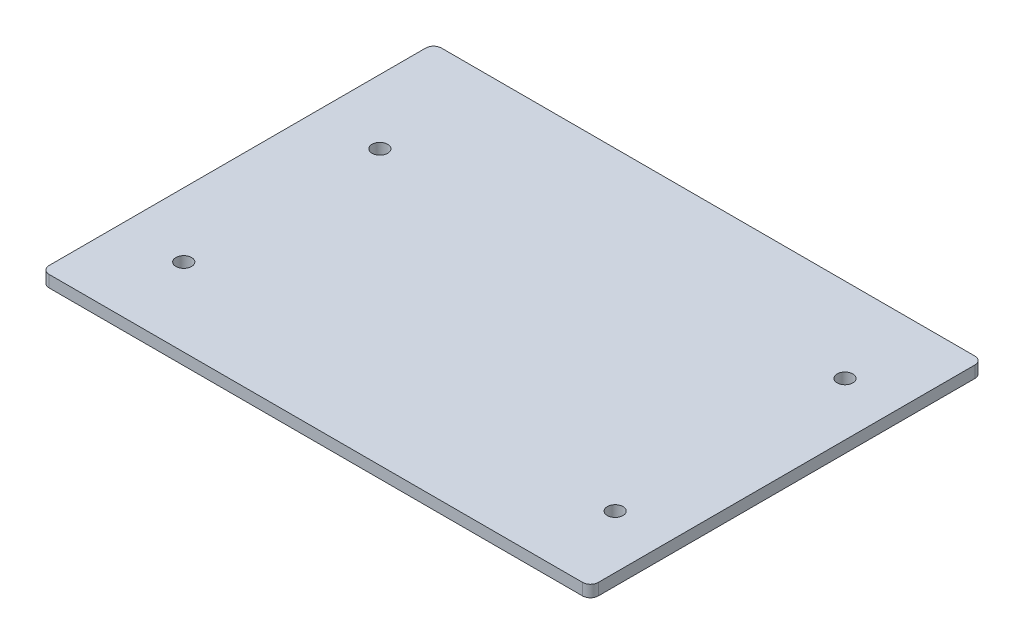
ISO-10303-21;
HEADER;
FILE_DESCRIPTION(('STEP AP214'),'2;1');
FILE_NAME('part.step','',(''),(''),'','','');
FILE_SCHEMA(('AUTOMOTIVE_DESIGN { 1 0 10303 214 1 1 1 1 }'));
ENDSEC;
DATA;
#1=APPLICATION_CONTEXT('core data for automotive mechanical design processes');
#2=APPLICATION_PROTOCOL_DEFINITION('international standard','automotive_design',2000,#1);
#3=PRODUCT_CONTEXT('',#1,'mechanical');
#4=PRODUCT('Part','Part','',(#3));
#5=PRODUCT_RELATED_PRODUCT_CATEGORY('part','',(#4));
#6=PRODUCT_DEFINITION_FORMATION('','',#4);
#7=PRODUCT_DEFINITION_CONTEXT('part definition',#1,'design');
#8=PRODUCT_DEFINITION('design','',#6,#7);
#9=PRODUCT_DEFINITION_SHAPE('','',#8);
#10=(LENGTH_UNIT() NAMED_UNIT(*) SI_UNIT(.MILLI.,.METRE.));
#11=(NAMED_UNIT(*) PLANE_ANGLE_UNIT() SI_UNIT($,.RADIAN.));
#12=(NAMED_UNIT(*) SI_UNIT($,.STERADIAN.) SOLID_ANGLE_UNIT());
#13=UNCERTAINTY_MEASURE_WITH_UNIT(LENGTH_MEASURE(1.E-05),#10,'distance_accuracy_value','');
#14=(GEOMETRIC_REPRESENTATION_CONTEXT(3) GLOBAL_UNCERTAINTY_ASSIGNED_CONTEXT((#13)) GLOBAL_UNIT_ASSIGNED_CONTEXT((#10,
#11,#12)) REPRESENTATION_CONTEXT('',''));
#15=CARTESIAN_POINT('',(0.,0.,0.));
#16=DIRECTION('',(0.,0.,1.));
#17=DIRECTION('',(1.,0.,0.));
#18=AXIS2_PLACEMENT_3D('',#15,#16,#17);
#19=CARTESIAN_POINT('',(0.,3.,50.));
#20=DIRECTION('',(0.,0.,1.));
#21=DIRECTION('',(1.,0.,0.));
#22=AXIS2_PLACEMENT_3D('',#19,#20,#21);
#23=PLANE('',#22);
#24=DIRECTION('',(-1.,0.,0.));
#25=VECTOR('',#24,1.);
#26=CARTESIAN_POINT('',(0.,0.,50.));
#27=LINE('',#26,#25);
#28=CARTESIAN_POINT('',(138.,0.,50.));
#29=VERTEX_POINT('',#28);
#30=CARTESIAN_POINT('',(2.,0.,50.));
#31=VERTEX_POINT('',#30);
#32=EDGE_CURVE('E111',#29,#31,#27,.T.);
#33=ORIENTED_EDGE('',*,*,#32,.F.);
#34=DIRECTION('',(0.,-1.,0.));
#35=VECTOR('',#34,1.);
#36=CARTESIAN_POINT('',(138.,3.,50.));
#37=LINE('',#36,#35);
#38=CARTESIAN_POINT('',(138.,3.,50.));
#39=VERTEX_POINT('',#38);
#40=EDGE_CURVE('E11',#29,#39,#37,.F.);
#41=ORIENTED_EDGE('',*,*,#40,.T.);
#42=DIRECTION('',(-1.,0.,0.));
#43=VECTOR('',#42,1.);
#44=CARTESIAN_POINT('',(0.,3.,50.));
#45=LINE('',#44,#43);
#46=CARTESIAN_POINT('',(2.,3.,50.));
#47=VERTEX_POINT('',#46);
#48=EDGE_CURVE('E163',#39,#47,#45,.T.);
#49=ORIENTED_EDGE('',*,*,#48,.T.);
#50=DIRECTION('',(0.,-1.,0.));
#51=VECTOR('',#50,1.);
#52=CARTESIAN_POINT('',(2.,3.,50.));
#53=LINE('',#52,#51);
#54=EDGE_CURVE('E47',#47,#31,#53,.T.);
#55=ORIENTED_EDGE('',*,*,#54,.T.);
#56=EDGE_LOOP('',(#33,#41,#49,#55));
#57=FACE_BOUND('',#56,.T.);
#58=ADVANCED_FACE('F39',(#57),#23,.T.);
#59=CARTESIAN_POINT('',(140.,3.,0.));
#60=DIRECTION('',(1.,0.,0.));
#61=DIRECTION('',(0.,0.,-1.));
#62=AXIS2_PLACEMENT_3D('',#59,#60,#61);
#63=PLANE('',#62);
#64=DIRECTION('',(0.,0.,1.));
#65=VECTOR('',#64,1.);
#66=CARTESIAN_POINT('',(140.,0.,0.));
#67=LINE('',#66,#65);
#68=CARTESIAN_POINT('',(140.,0.,-48.));
#69=VERTEX_POINT('',#68);
#70=CARTESIAN_POINT('',(140.,0.,48.));
#71=VERTEX_POINT('',#70);
#72=EDGE_CURVE('E185',#69,#71,#67,.T.);
#73=ORIENTED_EDGE('',*,*,#72,.F.);
#74=DIRECTION('',(0.,-1.,0.));
#75=VECTOR('',#74,1.);
#76=CARTESIAN_POINT('',(140.,3.,-48.));
#77=LINE('',#76,#75);
#78=CARTESIAN_POINT('',(140.,3.,-48.));
#79=VERTEX_POINT('',#78);
#80=EDGE_CURVE('E61',#69,#79,#77,.F.);
#81=ORIENTED_EDGE('',*,*,#80,.T.);
#82=DIRECTION('',(0.,0.,1.));
#83=VECTOR('',#82,1.);
#84=CARTESIAN_POINT('',(140.,3.,0.));
#85=LINE('',#84,#83);
#86=CARTESIAN_POINT('',(140.,3.,48.));
#87=VERTEX_POINT('',#86);
#88=EDGE_CURVE('E164',#79,#87,#85,.T.);
#89=ORIENTED_EDGE('',*,*,#88,.T.);
#90=DIRECTION('',(0.,-1.,0.));
#91=VECTOR('',#90,1.);
#92=CARTESIAN_POINT('',(140.,3.,48.));
#93=LINE('',#92,#91);
#94=EDGE_CURVE('E157',#87,#71,#93,.T.);
#95=ORIENTED_EDGE('',*,*,#94,.T.);
#96=EDGE_LOOP('',(#73,#81,#89,#95));
#97=FACE_BOUND('',#96,.T.);
#98=ADVANCED_FACE('F216',(#97),#63,.T.);
#99=CARTESIAN_POINT('',(0.,3.,-50.));
#100=DIRECTION('',(0.,0.,-1.));
#101=DIRECTION('',(-1.,0.,0.));
#102=AXIS2_PLACEMENT_3D('',#99,#100,#101);
#103=PLANE('',#102);
#104=DIRECTION('',(1.,0.,0.));
#105=VECTOR('',#104,1.);
#106=CARTESIAN_POINT('',(0.,0.,-50.));
#107=LINE('',#106,#105);
#108=CARTESIAN_POINT('',(2.,0.,-50.));
#109=VERTEX_POINT('',#108);
#110=CARTESIAN_POINT('',(138.,0.,-50.));
#111=VERTEX_POINT('',#110);
#112=EDGE_CURVE('E127',#109,#111,#107,.T.);
#113=ORIENTED_EDGE('',*,*,#112,.F.);
#114=DIRECTION('',(0.,-1.,0.));
#115=VECTOR('',#114,1.);
#116=CARTESIAN_POINT('',(2.,3.,-50.));
#117=LINE('',#116,#115);
#118=CARTESIAN_POINT('',(2.,3.,-50.));
#119=VERTEX_POINT('',#118);
#120=EDGE_CURVE('E149',#109,#119,#117,.F.);
#121=ORIENTED_EDGE('',*,*,#120,.T.);
#122=DIRECTION('',(1.,0.,0.));
#123=VECTOR('',#122,1.);
#124=CARTESIAN_POINT('',(0.,3.,-50.));
#125=LINE('',#124,#123);
#126=CARTESIAN_POINT('',(138.,3.,-50.));
#127=VERTEX_POINT('',#126);
#128=EDGE_CURVE('E167',#119,#127,#125,.T.);
#129=ORIENTED_EDGE('',*,*,#128,.T.);
#130=DIRECTION('',(0.,-1.,0.));
#131=VECTOR('',#130,1.);
#132=CARTESIAN_POINT('',(138.,3.,-50.));
#133=LINE('',#132,#131);
#134=EDGE_CURVE('E146',#127,#111,#133,.T.);
#135=ORIENTED_EDGE('',*,*,#134,.T.);
#136=EDGE_LOOP('',(#113,#121,#129,#135));
#137=FACE_BOUND('',#136,.T.);
#138=ADVANCED_FACE('F221',(#137),#103,.T.);
#139=CARTESIAN_POINT('',(126.4,3.,-28.5));
#140=DIRECTION('',(0.,-1.,0.));
#141=DIRECTION('',(0.,0.,-1.));
#142=AXIS2_PLACEMENT_3D('',#139,#140,#141);
#143=CYLINDRICAL_SURFACE('',#142,2.);
#144=CARTESIAN_POINT('',(126.4,3.,-28.5));
#145=DIRECTION('',(0.,1.,0.));
#146=DIRECTION('',(0.,0.,1.));
#147=AXIS2_PLACEMENT_3D('',#144,#145,#146);
#148=CIRCLE('',#147,2.);
#149=CARTESIAN_POINT('',(126.4,3.,-26.5));
#150=VERTEX_POINT('',#149);
#151=EDGE_CURVE('E135',#150,#150,#148,.T.);
#152=ORIENTED_EDGE('',*,*,#151,.T.);
#153=EDGE_LOOP('',(#152));
#154=FACE_BOUND('',#153,.T.);
#155=CARTESIAN_POINT('',(126.4,0.,-28.5));
#156=DIRECTION('',(0.,1.,0.));
#157=DIRECTION('',(0.,0.,1.));
#158=AXIS2_PLACEMENT_3D('',#155,#156,#157);
#159=CIRCLE('',#158,2.);
#160=CARTESIAN_POINT('',(126.4,0.,-26.5));
#161=VERTEX_POINT('',#160);
#162=EDGE_CURVE('E191',#161,#161,#159,.T.);
#163=ORIENTED_EDGE('',*,*,#162,.F.);
#164=EDGE_LOOP('',(#163));
#165=FACE_BOUND('',#164,.T.);
#166=ADVANCED_FACE('F253',(#154,#165),#143,.F.);
#167=CARTESIAN_POINT('',(16.4,3.,-19.9));
#168=DIRECTION('',(0.,-1.,0.));
#169=DIRECTION('',(0.,0.,-1.));
#170=AXIS2_PLACEMENT_3D('',#167,#168,#169);
#171=CYLINDRICAL_SURFACE('',#170,2.);
#172=CARTESIAN_POINT('',(16.4,3.,-19.9));
#173=DIRECTION('',(0.,1.,0.));
#174=DIRECTION('',(0.,0.,1.));
#175=AXIS2_PLACEMENT_3D('',#172,#173,#174);
#176=CIRCLE('',#175,2.);
#177=CARTESIAN_POINT('',(16.4,3.,-17.9));
#178=VERTEX_POINT('',#177);
#179=EDGE_CURVE('E176',#178,#178,#176,.T.);
#180=ORIENTED_EDGE('',*,*,#179,.T.);
#181=EDGE_LOOP('',(#180));
#182=FACE_BOUND('',#181,.T.);
#183=CARTESIAN_POINT('',(16.4,0.,-19.9));
#184=DIRECTION('',(0.,1.,0.));
#185=DIRECTION('',(0.,0.,1.));
#186=AXIS2_PLACEMENT_3D('',#183,#184,#185);
#187=CIRCLE('',#186,2.);
#188=CARTESIAN_POINT('',(16.4,0.,-17.9));
#189=VERTEX_POINT('',#188);
#190=EDGE_CURVE('E126',#189,#189,#187,.T.);
#191=ORIENTED_EDGE('',*,*,#190,.F.);
#192=EDGE_LOOP('',(#191));
#193=FACE_BOUND('',#192,.T.);
#194=ADVANCED_FACE('F256',(#182,#193),#171,.F.);
#195=CARTESIAN_POINT('',(0.,3.,0.));
#196=DIRECTION('',(-1.,0.,0.));
#197=DIRECTION('',(0.,0.,1.));
#198=AXIS2_PLACEMENT_3D('',#195,#196,#197);
#199=PLANE('',#198);
#200=DIRECTION('',(0.,0.,-1.));
#201=VECTOR('',#200,1.);
#202=CARTESIAN_POINT('',(0.,3.,0.));
#203=LINE('',#202,#201);
#204=CARTESIAN_POINT('',(0.,3.,48.));
#205=VERTEX_POINT('',#204);
#206=CARTESIAN_POINT('',(0.,3.,-48.));
#207=VERTEX_POINT('',#206);
#208=EDGE_CURVE('E174',#205,#207,#203,.T.);
#209=ORIENTED_EDGE('',*,*,#208,.T.);
#210=DIRECTION('',(0.,-1.,0.));
#211=VECTOR('',#210,1.);
#212=CARTESIAN_POINT('',(0.,3.,-48.));
#213=LINE('',#212,#211);
#214=CARTESIAN_POINT('',(0.,0.,-48.));
#215=VERTEX_POINT('',#214);
#216=EDGE_CURVE('E117',#207,#215,#213,.T.);
#217=ORIENTED_EDGE('',*,*,#216,.T.);
#218=DIRECTION('',(0.,0.,-1.));
#219=VECTOR('',#218,1.);
#220=CARTESIAN_POINT('',(0.,0.,0.));
#221=LINE('',#220,#219);
#222=CARTESIAN_POINT('',(0.,0.,48.));
#223=VERTEX_POINT('',#222);
#224=EDGE_CURVE('E109',#223,#215,#221,.T.);
#225=ORIENTED_EDGE('',*,*,#224,.F.);
#226=DIRECTION('',(0.,-1.,0.));
#227=VECTOR('',#226,1.);
#228=CARTESIAN_POINT('',(0.,3.,48.));
#229=LINE('',#228,#227);
#230=EDGE_CURVE('E123',#223,#205,#229,.F.);
#231=ORIENTED_EDGE('',*,*,#230,.T.);
#232=EDGE_LOOP('',(#209,#217,#225,#231));
#233=FACE_BOUND('',#232,.T.);
#234=ADVANCED_FACE('F122',(#233),#199,.T.);
#235=CARTESIAN_POINT('',(16.4,3.,30.1));
#236=DIRECTION('',(0.,-1.,0.));
#237=DIRECTION('',(0.,0.,-1.));
#238=AXIS2_PLACEMENT_3D('',#235,#236,#237);
#239=CYLINDRICAL_SURFACE('',#238,2.);
#240=CARTESIAN_POINT('',(16.4,3.,30.1));
#241=DIRECTION('',(0.,1.,0.));
#242=DIRECTION('',(0.,0.,1.));
#243=AXIS2_PLACEMENT_3D('',#240,#241,#242);
#244=CIRCLE('',#243,2.);
#245=CARTESIAN_POINT('',(16.4,3.,32.1));
#246=VERTEX_POINT('',#245);
#247=EDGE_CURVE('E165',#246,#246,#244,.T.);
#248=ORIENTED_EDGE('',*,*,#247,.T.);
#249=EDGE_LOOP('',(#248));
#250=FACE_BOUND('',#249,.T.);
#251=CARTESIAN_POINT('',(16.4,0.,30.1));
#252=DIRECTION('',(0.,1.,0.));
#253=DIRECTION('',(0.,0.,1.));
#254=AXIS2_PLACEMENT_3D('',#251,#252,#253);
#255=CIRCLE('',#254,2.);
#256=CARTESIAN_POINT('',(16.4,0.,32.1));
#257=VERTEX_POINT('',#256);
#258=EDGE_CURVE('E181',#257,#257,#255,.T.);
#259=ORIENTED_EDGE('',*,*,#258,.F.);
#260=EDGE_LOOP('',(#259));
#261=FACE_BOUND('',#260,.T.);
#262=ADVANCED_FACE('F202',(#250,#261),#239,.F.);
#263=CARTESIAN_POINT('',(126.4,3.,30.1));
#264=DIRECTION('',(0.,-1.,0.));
#265=DIRECTION('',(0.,0.,-1.));
#266=AXIS2_PLACEMENT_3D('',#263,#264,#265);
#267=CYLINDRICAL_SURFACE('',#266,2.);
#268=CARTESIAN_POINT('',(126.4,3.,30.1));
#269=DIRECTION('',(0.,1.,0.));
#270=DIRECTION('',(0.,0.,1.));
#271=AXIS2_PLACEMENT_3D('',#268,#269,#270);
#272=CIRCLE('',#271,2.);
#273=CARTESIAN_POINT('',(126.4,3.,32.1));
#274=VERTEX_POINT('',#273);
#275=EDGE_CURVE('E131',#274,#274,#272,.T.);
#276=ORIENTED_EDGE('',*,*,#275,.T.);
#277=EDGE_LOOP('',(#276));
#278=FACE_BOUND('',#277,.T.);
#279=CARTESIAN_POINT('',(126.4,0.,30.1));
#280=DIRECTION('',(0.,1.,0.));
#281=DIRECTION('',(0.,0.,1.));
#282=AXIS2_PLACEMENT_3D('',#279,#280,#281);
#283=CIRCLE('',#282,2.);
#284=CARTESIAN_POINT('',(126.4,0.,32.1));
#285=VERTEX_POINT('',#284);
#286=EDGE_CURVE('E138',#285,#285,#283,.T.);
#287=ORIENTED_EDGE('',*,*,#286,.F.);
#288=EDGE_LOOP('',(#287));
#289=FACE_BOUND('',#288,.T.);
#290=ADVANCED_FACE('F199',(#278,#289),#267,.F.);
#291=CARTESIAN_POINT('',(0.,3.,0.));
#292=DIRECTION('',(0.,1.,0.));
#293=DIRECTION('',(0.,0.,1.));
#294=AXIS2_PLACEMENT_3D('',#291,#292,#293);
#295=PLANE('',#294);
#296=ORIENTED_EDGE('',*,*,#247,.F.);
#297=EDGE_LOOP('',(#296));
#298=FACE_BOUND('',#297,.T.);
#299=ORIENTED_EDGE('',*,*,#128,.F.);
#300=CARTESIAN_POINT('',(2.,3.,-48.));
#301=DIRECTION('',(0.,1.,0.));
#302=DIRECTION('',(0.,0.,1.));
#303=AXIS2_PLACEMENT_3D('',#300,#301,#302);
#304=CIRCLE('',#303,2.);
#305=EDGE_CURVE('E155',#119,#207,#304,.T.);
#306=ORIENTED_EDGE('',*,*,#305,.T.);
#307=ORIENTED_EDGE('',*,*,#208,.F.);
#308=CARTESIAN_POINT('',(2.,3.,48.));
#309=DIRECTION('',(0.,1.,0.));
#310=DIRECTION('',(0.,0.,1.));
#311=AXIS2_PLACEMENT_3D('',#308,#309,#310);
#312=CIRCLE('',#311,2.);
#313=EDGE_CURVE('E130',#205,#47,#312,.T.);
#314=ORIENTED_EDGE('',*,*,#313,.T.);
#315=ORIENTED_EDGE('',*,*,#48,.F.);
#316=CARTESIAN_POINT('',(138.,3.,48.));
#317=DIRECTION('',(0.,1.,0.));
#318=DIRECTION('',(0.,0.,1.));
#319=AXIS2_PLACEMENT_3D('',#316,#317,#318);
#320=CIRCLE('',#319,2.);
#321=EDGE_CURVE('E54',#39,#87,#320,.T.);
#322=ORIENTED_EDGE('',*,*,#321,.T.);
#323=ORIENTED_EDGE('',*,*,#88,.F.);
#324=CARTESIAN_POINT('',(138.,3.,-48.));
#325=DIRECTION('',(0.,1.,0.));
#326=DIRECTION('',(0.,0.,1.));
#327=AXIS2_PLACEMENT_3D('',#324,#325,#326);
#328=CIRCLE('',#327,2.);
#329=EDGE_CURVE('E153',#79,#127,#328,.T.);
#330=ORIENTED_EDGE('',*,*,#329,.T.);
#331=EDGE_LOOP('',(#299,#306,#307,#314,#315,#322,#323,#330));
#332=FACE_BOUND('',#331,.T.);
#333=ORIENTED_EDGE('',*,*,#179,.F.);
#334=EDGE_LOOP('',(#333));
#335=FACE_BOUND('',#334,.T.);
#336=ORIENTED_EDGE('',*,*,#151,.F.);
#337=EDGE_LOOP('',(#336));
#338=FACE_BOUND('',#337,.T.);
#339=ORIENTED_EDGE('',*,*,#275,.F.);
#340=EDGE_LOOP('',(#339));
#341=FACE_BOUND('',#340,.T.);
#342=ADVANCED_FACE('F201',(#298,#332,#335,#338,#341),#295,.T.);
#343=CARTESIAN_POINT('',(0.,0.,0.));
#344=DIRECTION('',(0.,1.,0.));
#345=DIRECTION('',(0.,0.,1.));
#346=AXIS2_PLACEMENT_3D('',#343,#344,#345);
#347=PLANE('',#346);
#348=ORIENTED_EDGE('',*,*,#258,.T.);
#349=EDGE_LOOP('',(#348));
#350=FACE_BOUND('',#349,.T.);
#351=ORIENTED_EDGE('',*,*,#224,.T.);
#352=CARTESIAN_POINT('',(2.,0.,-48.));
#353=DIRECTION('',(0.,1.,0.));
#354=DIRECTION('',(0.,0.,1.));
#355=AXIS2_PLACEMENT_3D('',#352,#353,#354);
#356=CIRCLE('',#355,2.);
#357=EDGE_CURVE('E144',#215,#109,#356,.F.);
#358=ORIENTED_EDGE('',*,*,#357,.T.);
#359=ORIENTED_EDGE('',*,*,#112,.T.);
#360=CARTESIAN_POINT('',(138.,0.,-48.));
#361=DIRECTION('',(0.,1.,0.));
#362=DIRECTION('',(0.,0.,1.));
#363=AXIS2_PLACEMENT_3D('',#360,#361,#362);
#364=CIRCLE('',#363,2.);
#365=EDGE_CURVE('E142',#111,#69,#364,.F.);
#366=ORIENTED_EDGE('',*,*,#365,.T.);
#367=ORIENTED_EDGE('',*,*,#72,.T.);
#368=CARTESIAN_POINT('',(138.,0.,48.));
#369=DIRECTION('',(0.,1.,0.));
#370=DIRECTION('',(0.,0.,1.));
#371=AXIS2_PLACEMENT_3D('',#368,#369,#370);
#372=CIRCLE('',#371,2.);
#373=EDGE_CURVE('E116',#71,#29,#372,.F.);
#374=ORIENTED_EDGE('',*,*,#373,.T.);
#375=ORIENTED_EDGE('',*,*,#32,.T.);
#376=CARTESIAN_POINT('',(2.,0.,48.));
#377=DIRECTION('',(0.,1.,0.));
#378=DIRECTION('',(0.,0.,1.));
#379=AXIS2_PLACEMENT_3D('',#376,#377,#378);
#380=CIRCLE('',#379,2.);
#381=EDGE_CURVE('E105',#31,#223,#380,.F.);
#382=ORIENTED_EDGE('',*,*,#381,.T.);
#383=EDGE_LOOP('',(#351,#358,#359,#366,#367,#374,#375,#382));
#384=FACE_BOUND('',#383,.T.);
#385=ORIENTED_EDGE('',*,*,#190,.T.);
#386=EDGE_LOOP('',(#385));
#387=FACE_BOUND('',#386,.T.);
#388=ORIENTED_EDGE('',*,*,#162,.T.);
#389=EDGE_LOOP('',(#388));
#390=FACE_BOUND('',#389,.T.);
#391=ORIENTED_EDGE('',*,*,#286,.T.);
#392=EDGE_LOOP('',(#391));
#393=FACE_BOUND('',#392,.T.);
#394=ADVANCED_FACE('F107',(#350,#384,#387,#390,#393),#347,.F.);
#395=CARTESIAN_POINT('',(2.,3.,-48.));
#396=DIRECTION('',(0.,-1.,0.));
#397=DIRECTION('',(0.,0.,-1.));
#398=AXIS2_PLACEMENT_3D('',#395,#396,#397);
#399=CYLINDRICAL_SURFACE('',#398,2.);
#400=ORIENTED_EDGE('',*,*,#305,.F.);
#401=ORIENTED_EDGE('',*,*,#120,.F.);
#402=ORIENTED_EDGE('',*,*,#357,.F.);
#403=ORIENTED_EDGE('',*,*,#216,.F.);
#404=EDGE_LOOP('',(#400,#401,#402,#403));
#405=FACE_BOUND('',#404,.T.);
#406=ADVANCED_FACE('F225',(#405),#399,.T.);
#407=CARTESIAN_POINT('',(138.,3.,-48.));
#408=DIRECTION('',(0.,-1.,0.));
#409=DIRECTION('',(0.,0.,-1.));
#410=AXIS2_PLACEMENT_3D('',#407,#408,#409);
#411=CYLINDRICAL_SURFACE('',#410,2.);
#412=ORIENTED_EDGE('',*,*,#329,.F.);
#413=ORIENTED_EDGE('',*,*,#80,.F.);
#414=ORIENTED_EDGE('',*,*,#365,.F.);
#415=ORIENTED_EDGE('',*,*,#134,.F.);
#416=EDGE_LOOP('',(#412,#413,#414,#415));
#417=FACE_BOUND('',#416,.T.);
#418=ADVANCED_FACE('F228',(#417),#411,.T.);
#419=CARTESIAN_POINT('',(138.,3.,48.));
#420=DIRECTION('',(0.,-1.,0.));
#421=DIRECTION('',(0.,0.,-1.));
#422=AXIS2_PLACEMENT_3D('',#419,#420,#421);
#423=CYLINDRICAL_SURFACE('',#422,2.);
#424=ORIENTED_EDGE('',*,*,#321,.F.);
#425=ORIENTED_EDGE('',*,*,#40,.F.);
#426=ORIENTED_EDGE('',*,*,#373,.F.);
#427=ORIENTED_EDGE('',*,*,#94,.F.);
#428=EDGE_LOOP('',(#424,#425,#426,#427));
#429=FACE_BOUND('',#428,.T.);
#430=ADVANCED_FACE('F231',(#429),#423,.T.);
#431=CARTESIAN_POINT('',(2.,3.,48.));
#432=DIRECTION('',(0.,-1.,0.));
#433=DIRECTION('',(0.,0.,-1.));
#434=AXIS2_PLACEMENT_3D('',#431,#432,#433);
#435=CYLINDRICAL_SURFACE('',#434,2.);
#436=ORIENTED_EDGE('',*,*,#313,.F.);
#437=ORIENTED_EDGE('',*,*,#230,.F.);
#438=ORIENTED_EDGE('',*,*,#381,.F.);
#439=ORIENTED_EDGE('',*,*,#54,.F.);
#440=EDGE_LOOP('',(#436,#437,#438,#439));
#441=FACE_BOUND('',#440,.T.);
#442=ADVANCED_FACE('F41',(#441),#435,.T.);
#443=CLOSED_SHELL('',(#58,#98,#138,#166,#194,#234,#262,#290,#342,#394,#406,#418,#430,#442));
#444=MANIFOLD_SOLID_BREP('B2',#443);
#445=ADVANCED_BREP_SHAPE_REPRESENTATION('',(#18,#444),#14);
#446=SHAPE_DEFINITION_REPRESENTATION(#9,#445);
ENDSEC;
END-ISO-10303-21;
